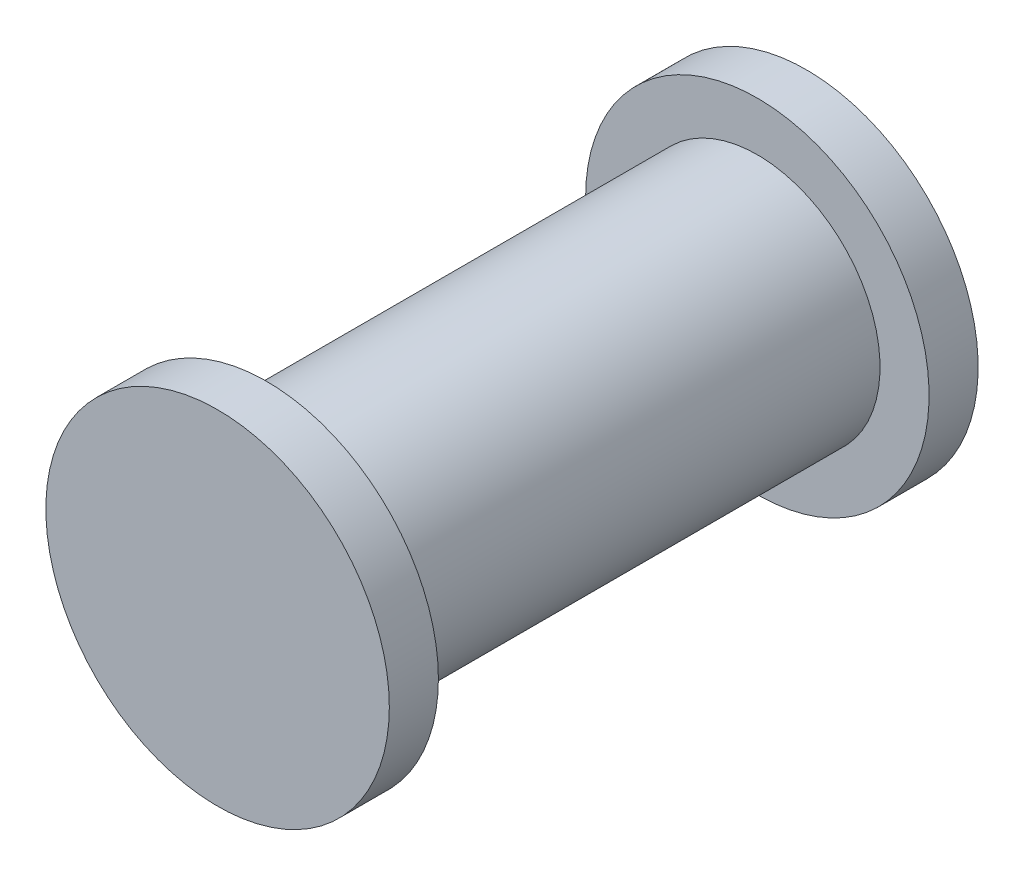
ISO-10303-21;
HEADER;
FILE_DESCRIPTION(('STEP AP214'),'2;1');
FILE_NAME('part.step','',(''),(''),'','','');
FILE_SCHEMA(('AUTOMOTIVE_DESIGN { 1 0 10303 214 1 1 1 1 }'));
ENDSEC;
DATA;
#1=APPLICATION_CONTEXT('core data for automotive mechanical design processes');
#2=APPLICATION_PROTOCOL_DEFINITION('international standard','automotive_design',2000,#1);
#3=PRODUCT_CONTEXT('',#1,'mechanical');
#4=PRODUCT('Part','Part','',(#3));
#5=PRODUCT_RELATED_PRODUCT_CATEGORY('part','',(#4));
#6=PRODUCT_DEFINITION_FORMATION('','',#4);
#7=PRODUCT_DEFINITION_CONTEXT('part definition',#1,'design');
#8=PRODUCT_DEFINITION('design','',#6,#7);
#9=PRODUCT_DEFINITION_SHAPE('','',#8);
#10=(LENGTH_UNIT() NAMED_UNIT(*) SI_UNIT(.MILLI.,.METRE.));
#11=(NAMED_UNIT(*) PLANE_ANGLE_UNIT() SI_UNIT($,.RADIAN.));
#12=(NAMED_UNIT(*) SI_UNIT($,.STERADIAN.) SOLID_ANGLE_UNIT());
#13=UNCERTAINTY_MEASURE_WITH_UNIT(LENGTH_MEASURE(1.E-05),#10,'distance_accuracy_value','');
#14=(GEOMETRIC_REPRESENTATION_CONTEXT(3) GLOBAL_UNCERTAINTY_ASSIGNED_CONTEXT((#13)) GLOBAL_UNIT_ASSIGNED_CONTEXT((#10,
#11,#12)) REPRESENTATION_CONTEXT('',''));
#15=CARTESIAN_POINT('',(0.,0.,0.));
#16=DIRECTION('',(0.,0.,1.));
#17=DIRECTION('',(1.,0.,0.));
#18=AXIS2_PLACEMENT_3D('',#15,#16,#17);
#19=CARTESIAN_POINT('',(0.,0.,50.));
#20=DIRECTION('',(0.,0.,-1.));
#21=DIRECTION('',(-1.,0.,0.));
#22=AXIS2_PLACEMENT_3D('',#19,#20,#21);
#23=CYLINDRICAL_SURFACE('',#22,12.5);
#24=CARTESIAN_POINT('',(0.,0.,50.));
#25=DIRECTION('',(0.,0.,1.));
#26=DIRECTION('',(1.,0.,0.));
#27=AXIS2_PLACEMENT_3D('',#24,#25,#26);
#28=CIRCLE('',#27,12.5);
#29=CARTESIAN_POINT('',(12.5,0.,50.));
#30=VERTEX_POINT('',#29);
#31=EDGE_CURVE('E10',#30,#30,#28,.T.);
#32=ORIENTED_EDGE('',*,*,#31,.F.);
#33=EDGE_LOOP('',(#32));
#34=FACE_BOUND('',#33,.T.);
#35=CARTESIAN_POINT('',(0.,0.,0.));
#36=DIRECTION('',(0.,0.,-1.));
#37=DIRECTION('',(-1.,0.,0.));
#38=AXIS2_PLACEMENT_3D('',#35,#36,#37);
#39=CIRCLE('',#38,12.5);
#40=CARTESIAN_POINT('',(-12.5,0.,0.));
#41=VERTEX_POINT('',#40);
#42=EDGE_CURVE('E45',#41,#41,#39,.T.);
#43=ORIENTED_EDGE('',*,*,#42,.F.);
#44=EDGE_LOOP('',(#43));
#45=FACE_BOUND('',#44,.T.);
#46=ADVANCED_FACE('F30',(#34,#45),#23,.T.);
#47=CARTESIAN_POINT('',(0.,0.,50.));
#48=DIRECTION('',(0.,0.,1.));
#49=DIRECTION('',(1.,0.,0.));
#50=AXIS2_PLACEMENT_3D('',#47,#48,#49);
#51=PLANE('',#50);
#52=CARTESIAN_POINT('',(0.,0.,50.));
#53=DIRECTION('',(0.,0.,1.));
#54=DIRECTION('',(1.,0.,0.));
#55=AXIS2_PLACEMENT_3D('',#52,#53,#54);
#56=CIRCLE('',#55,17.5);
#57=CARTESIAN_POINT('',(17.5,0.,50.));
#58=VERTEX_POINT('',#57);
#59=EDGE_CURVE('E40',#58,#58,#56,.T.);
#60=ORIENTED_EDGE('',*,*,#59,.F.);
#61=EDGE_LOOP('',(#60));
#62=FACE_BOUND('',#61,.T.);
#63=ORIENTED_EDGE('',*,*,#31,.T.);
#64=EDGE_LOOP('',(#63));
#65=FACE_BOUND('',#64,.T.);
#66=ADVANCED_FACE('F72',(#62,#65),#51,.F.);
#67=CARTESIAN_POINT('',(0.,0.,55.));
#68=DIRECTION('',(0.,0.,-1.));
#69=DIRECTION('',(-1.,0.,0.));
#70=AXIS2_PLACEMENT_3D('',#67,#68,#69);
#71=CYLINDRICAL_SURFACE('',#70,17.5);
#72=CARTESIAN_POINT('',(0.,0.,55.));
#73=DIRECTION('',(0.,0.,1.));
#74=DIRECTION('',(1.,0.,0.));
#75=AXIS2_PLACEMENT_3D('',#72,#73,#74);
#76=CIRCLE('',#75,17.5);
#77=CARTESIAN_POINT('',(17.5,0.,55.));
#78=VERTEX_POINT('',#77);
#79=EDGE_CURVE('E36',#78,#78,#76,.T.);
#80=ORIENTED_EDGE('',*,*,#79,.F.);
#81=EDGE_LOOP('',(#80));
#82=FACE_BOUND('',#81,.T.);
#83=ORIENTED_EDGE('',*,*,#59,.T.);
#84=EDGE_LOOP('',(#83));
#85=FACE_BOUND('',#84,.T.);
#86=ADVANCED_FACE('F77',(#82,#85),#71,.T.);
#87=CARTESIAN_POINT('',(0.,0.,55.));
#88=DIRECTION('',(0.,0.,1.));
#89=DIRECTION('',(1.,0.,0.));
#90=AXIS2_PLACEMENT_3D('',#87,#88,#89);
#91=PLANE('',#90);
#92=ORIENTED_EDGE('',*,*,#79,.T.);
#93=EDGE_LOOP('',(#92));
#94=FACE_BOUND('',#93,.T.);
#95=ADVANCED_FACE('F67',(#94),#91,.T.);
#96=CARTESIAN_POINT('',(0.,0.,0.));
#97=DIRECTION('',(0.,0.,-1.));
#98=DIRECTION('',(-1.,0.,0.));
#99=AXIS2_PLACEMENT_3D('',#96,#97,#98);
#100=PLANE('',#99);
#101=CARTESIAN_POINT('',(0.,0.,0.));
#102=DIRECTION('',(0.,0.,-1.));
#103=DIRECTION('',(-1.,0.,0.));
#104=AXIS2_PLACEMENT_3D('',#101,#102,#103);
#105=CIRCLE('',#104,17.5);
#106=CARTESIAN_POINT('',(-17.5,0.,0.));
#107=VERTEX_POINT('',#106);
#108=EDGE_CURVE('E50',#107,#107,#105,.T.);
#109=ORIENTED_EDGE('',*,*,#108,.F.);
#110=EDGE_LOOP('',(#109));
#111=FACE_BOUND('',#110,.T.);
#112=ORIENTED_EDGE('',*,*,#42,.T.);
#113=EDGE_LOOP('',(#112));
#114=FACE_BOUND('',#113,.T.);
#115=ADVANCED_FACE('F61',(#111,#114),#100,.F.);
#116=CARTESIAN_POINT('',(0.,0.,-5.));
#117=DIRECTION('',(0.,0.,1.));
#118=DIRECTION('',(1.,0.,0.));
#119=AXIS2_PLACEMENT_3D('',#116,#117,#118);
#120=CYLINDRICAL_SURFACE('',#119,17.5);
#121=CARTESIAN_POINT('',(0.,0.,-5.));
#122=DIRECTION('',(0.,0.,-1.));
#123=DIRECTION('',(-1.,0.,0.));
#124=AXIS2_PLACEMENT_3D('',#121,#122,#123);
#125=CIRCLE('',#124,17.5);
#126=CARTESIAN_POINT('',(-17.5,0.,-5.));
#127=VERTEX_POINT('',#126);
#128=EDGE_CURVE('E49',#127,#127,#125,.T.);
#129=ORIENTED_EDGE('',*,*,#128,.F.);
#130=EDGE_LOOP('',(#129));
#131=FACE_BOUND('',#130,.T.);
#132=ORIENTED_EDGE('',*,*,#108,.T.);
#133=EDGE_LOOP('',(#132));
#134=FACE_BOUND('',#133,.T.);
#135=ADVANCED_FACE('F58',(#131,#134),#120,.T.);
#136=CARTESIAN_POINT('',(0.,0.,-5.));
#137=DIRECTION('',(0.,0.,-1.));
#138=DIRECTION('',(-1.,0.,0.));
#139=AXIS2_PLACEMENT_3D('',#136,#137,#138);
#140=PLANE('',#139);
#141=ORIENTED_EDGE('',*,*,#128,.T.);
#142=EDGE_LOOP('',(#141));
#143=FACE_BOUND('',#142,.T.);
#144=ADVANCED_FACE('F56',(#143),#140,.T.);
#145=CLOSED_SHELL('',(#46,#66,#86,#95,#115,#135,#144));
#146=MANIFOLD_SOLID_BREP('B2',#145);
#147=ADVANCED_BREP_SHAPE_REPRESENTATION('',(#18,#146),#14);
#148=SHAPE_DEFINITION_REPRESENTATION(#9,#147);
ENDSEC;
END-ISO-10303-21;
